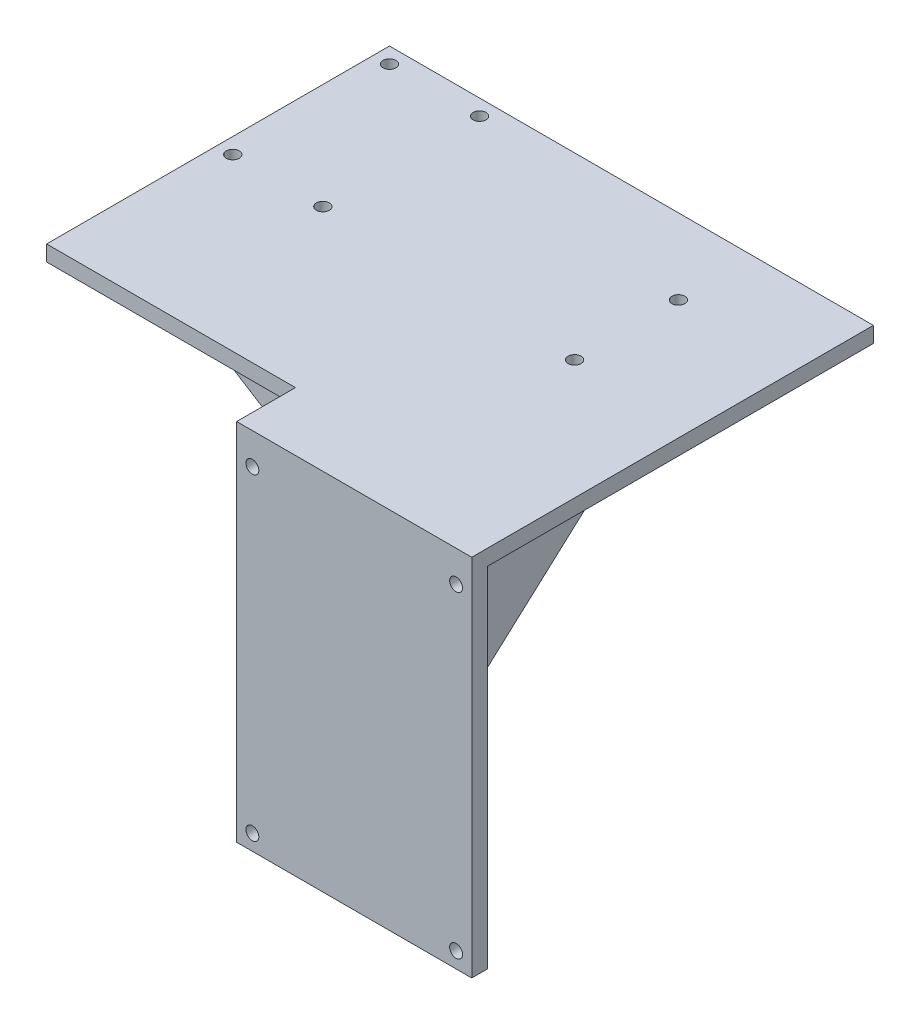
ISO-10303-21;
HEADER;
FILE_DESCRIPTION(('STEP AP214'),'2;1');
FILE_NAME('part.step','',(''),(''),'','','');
FILE_SCHEMA(('AUTOMOTIVE_DESIGN { 1 0 10303 214 1 1 1 1 }'));
ENDSEC;
DATA;
#1=APPLICATION_CONTEXT('core data for automotive mechanical design processes');
#2=APPLICATION_PROTOCOL_DEFINITION('international standard','automotive_design',2000,#1);
#3=PRODUCT_CONTEXT('',#1,'mechanical');
#4=PRODUCT('Part','Part','',(#3));
#5=PRODUCT_RELATED_PRODUCT_CATEGORY('part','',(#4));
#6=PRODUCT_DEFINITION_FORMATION('','',#4);
#7=PRODUCT_DEFINITION_CONTEXT('part definition',#1,'design');
#8=PRODUCT_DEFINITION('design','',#6,#7);
#9=PRODUCT_DEFINITION_SHAPE('','',#8);
#10=(LENGTH_UNIT() NAMED_UNIT(*) SI_UNIT(.MILLI.,.METRE.));
#11=(NAMED_UNIT(*) PLANE_ANGLE_UNIT() SI_UNIT($,.RADIAN.));
#12=(NAMED_UNIT(*) SI_UNIT($,.STERADIAN.) SOLID_ANGLE_UNIT());
#13=UNCERTAINTY_MEASURE_WITH_UNIT(LENGTH_MEASURE(1.E-05),#10,'distance_accuracy_value','');
#14=(GEOMETRIC_REPRESENTATION_CONTEXT(3) GLOBAL_UNCERTAINTY_ASSIGNED_CONTEXT((#13)) GLOBAL_UNIT_ASSIGNED_CONTEXT((#10,
#11,#12)) REPRESENTATION_CONTEXT('',''));
#15=CARTESIAN_POINT('',(0.,0.,0.));
#16=DIRECTION('',(0.,0.,1.));
#17=DIRECTION('',(1.,0.,0.));
#18=AXIS2_PLACEMENT_3D('',#15,#16,#17);
#19=CARTESIAN_POINT('',(60.,-4.,-15.));
#20=DIRECTION('',(0.,1.,0.));
#21=DIRECTION('',(0.,0.,1.));
#22=AXIS2_PLACEMENT_3D('',#19,#20,#21);
#23=PLANE('',#22);
#24=CARTESIAN_POINT('',(-59.5,-4.,-98.5));
#25=DIRECTION('',(0.,1.,0.));
#26=DIRECTION('',(0.,0.,1.));
#27=AXIS2_PLACEMENT_3D('',#24,#25,#26);
#28=CIRCLE('',#27,1.65);
#29=CARTESIAN_POINT('',(-59.5,-4.,-96.85));
#30=VERTEX_POINT('',#29);
#31=EDGE_CURVE('E215',#30,#30,#28,.T.);
#32=ORIENTED_EDGE('',*,*,#31,.T.);
#33=EDGE_LOOP('',(#32));
#34=FACE_BOUND('',#33,.T.);
#35=CARTESIAN_POINT('',(-36.5,-4.,-58.5));
#36=DIRECTION('',(0.,1.,0.));
#37=DIRECTION('',(0.,0.,1.));
#38=AXIS2_PLACEMENT_3D('',#35,#36,#37);
#39=CIRCLE('',#38,1.65);
#40=CARTESIAN_POINT('',(-36.5,-4.,-56.85));
#41=VERTEX_POINT('',#40);
#42=EDGE_CURVE('E220',#41,#41,#39,.T.);
#43=ORIENTED_EDGE('',*,*,#42,.T.);
#44=EDGE_LOOP('',(#43));
#45=FACE_BOUND('',#44,.T.);
#46=CARTESIAN_POINT('',(-59.5,-4.,-58.5));
#47=DIRECTION('',(0.,1.,0.));
#48=DIRECTION('',(0.,0.,1.));
#49=AXIS2_PLACEMENT_3D('',#46,#47,#48);
#50=CIRCLE('',#49,1.65);
#51=CARTESIAN_POINT('',(-59.5,-4.,-56.85));
#52=VERTEX_POINT('',#51);
#53=EDGE_CURVE('E223',#52,#52,#50,.T.);
#54=ORIENTED_EDGE('',*,*,#53,.T.);
#55=EDGE_LOOP('',(#54));
#56=FACE_BOUND('',#55,.T.);
#57=CARTESIAN_POINT('',(-36.5,-4.,-98.5));
#58=DIRECTION('',(0.,1.,0.));
#59=DIRECTION('',(0.,0.,1.));
#60=AXIS2_PLACEMENT_3D('',#57,#58,#59);
#61=CIRCLE('',#60,1.65);
#62=CARTESIAN_POINT('',(-36.5,-4.,-96.85));
#63=VERTEX_POINT('',#62);
#64=EDGE_CURVE('E227',#63,#63,#61,.T.);
#65=ORIENTED_EDGE('',*,*,#64,.T.);
#66=EDGE_LOOP('',(#65));
#67=FACE_BOUND('',#66,.T.);
#68=DIRECTION('',(1.,0.,0.));
#69=VECTOR('',#68,1.);
#70=CARTESIAN_POINT('',(-63.5,-4.,-50.5));
#71=LINE('',#70,#69);
#72=CARTESIAN_POINT('',(-63.5,-4.,-50.5));
#73=VERTEX_POINT('',#72);
#74=CARTESIAN_POINT('',(8.00000000000001,-4.,-50.5));
#75=VERTEX_POINT('',#74);
#76=EDGE_CURVE('E146',#73,#75,#71,.T.);
#77=ORIENTED_EDGE('',*,*,#76,.F.);
#78=DIRECTION('',(0.,0.,1.));
#79=VECTOR('',#78,1.);
#80=CARTESIAN_POINT('',(-63.5,-4.,-102.5));
#81=LINE('',#80,#79);
#82=CARTESIAN_POINT('',(-63.5,-4.,-102.5));
#83=VERTEX_POINT('',#82);
#84=EDGE_CURVE('E155',#83,#73,#81,.T.);
#85=ORIENTED_EDGE('',*,*,#84,.F.);
#86=DIRECTION('',(-1.,0.,0.));
#87=VECTOR('',#86,1.);
#88=CARTESIAN_POINT('',(60.,-4.,-102.5));
#89=LINE('',#88,#87);
#90=CARTESIAN_POINT('',(8.,-4.,-102.5));
#91=VERTEX_POINT('',#90);
#92=EDGE_CURVE('E256',#91,#83,#89,.T.);
#93=ORIENTED_EDGE('',*,*,#92,.F.);
#94=DIRECTION('',(0.,0.,-1.));
#95=VECTOR('',#94,1.);
#96=CARTESIAN_POINT('',(8.,-4.,-102.5));
#97=LINE('',#96,#95);
#98=EDGE_CURVE('E157',#75,#91,#97,.T.);
#99=ORIENTED_EDGE('',*,*,#98,.F.);
#100=EDGE_LOOP('',(#77,#85,#93,#99));
#101=FACE_BOUND('',#100,.T.);
#102=ADVANCED_FACE('F33',(#34,#45,#56,#67,#101),#23,.F.);
#103=DIRECTION('',(-1.,0.,0.));
#104=VECTOR('',#103,1.);
#105=CARTESIAN_POINT('',(-63.5,-4.,-33.5));
#106=LINE('',#105,#104);
#107=CARTESIAN_POINT('',(8.,-4.,-33.5));
#108=VERTEX_POINT('',#107);
#109=CARTESIAN_POINT('',(-63.5,-4.,-33.5));
#110=VERTEX_POINT('',#109);
#111=EDGE_CURVE('E158',#108,#110,#106,.T.);
#112=ORIENTED_EDGE('',*,*,#111,.F.);
#113=CARTESIAN_POINT('',(8.,-4.,-4.00000000000002));
#114=VERTEX_POINT('',#113);
#115=EDGE_CURVE('E327',#114,#108,#97,.T.);
#116=ORIENTED_EDGE('',*,*,#115,.F.);
#117=DIRECTION('',(-1.,0.,0.));
#118=VECTOR('',#117,1.);
#119=CARTESIAN_POINT('',(8.,-4.,-4.00000000000002));
#120=LINE('',#119,#118);
#121=CARTESIAN_POINT('',(0.,-4.,-4.00000000000002));
#122=VERTEX_POINT('',#121);
#123=EDGE_CURVE('E332',#114,#122,#120,.T.);
#124=ORIENTED_EDGE('',*,*,#123,.T.);
#125=DIRECTION('',(0.,0.,-1.));
#126=VECTOR('',#125,1.);
#127=CARTESIAN_POINT('',(0.,-4.,-102.5));
#128=LINE('',#127,#126);
#129=CARTESIAN_POINT('',(0.,-4.,-15.));
#130=VERTEX_POINT('',#129);
#131=EDGE_CURVE('E283',#122,#130,#128,.T.);
#132=ORIENTED_EDGE('',*,*,#131,.T.);
#133=DIRECTION('',(-1.,0.,0.));
#134=VECTOR('',#133,1.);
#135=CARTESIAN_POINT('',(60.,-4.,-15.));
#136=LINE('',#135,#134);
#137=CARTESIAN_POINT('',(-63.5,-4.,-15.));
#138=VERTEX_POINT('',#137);
#139=EDGE_CURVE('E218',#130,#138,#136,.T.);
#140=ORIENTED_EDGE('',*,*,#139,.T.);
#141=EDGE_CURVE('E163',#110,#138,#81,.T.);
#142=ORIENTED_EDGE('',*,*,#141,.F.);
#143=EDGE_LOOP('',(#112,#116,#124,#132,#140,#142));
#144=FACE_BOUND('',#143,.T.);
#145=ADVANCED_FACE('F368',(#144),#23,.F.);
#146=CARTESIAN_POINT('',(8.,0.,0.));
#147=DIRECTION('',(-1.,0.,0.));
#148=DIRECTION('',(0.,0.,1.));
#149=AXIS2_PLACEMENT_3D('',#146,#147,#148);
#150=PLANE('',#149);
#151=DIRECTION('',(0.,1.,0.));
#152=VECTOR('',#151,1.);
#153=CARTESIAN_POINT('',(8.,-49.,-33.5));
#154=LINE('',#153,#152);
#155=CARTESIAN_POINT('',(8.,-49.,-33.5));
#156=VERTEX_POINT('',#155);
#157=EDGE_CURVE('E442',#156,#108,#154,.T.);
#158=ORIENTED_EDGE('',*,*,#157,.F.);
#159=DIRECTION('',(0.,0.,1.));
#160=VECTOR('',#159,1.);
#161=CARTESIAN_POINT('',(8.00000000000001,-49.,-50.5));
#162=LINE('',#161,#160);
#163=CARTESIAN_POINT('',(8.,-49.,-50.5));
#164=VERTEX_POINT('',#163);
#165=EDGE_CURVE('E443',#164,#156,#162,.T.);
#166=ORIENTED_EDGE('',*,*,#165,.F.);
#167=DIRECTION('',(0.,1.,0.));
#168=VECTOR('',#167,1.);
#169=CARTESIAN_POINT('',(8.00000000000001,-49.,-50.5));
#170=LINE('',#169,#168);
#171=EDGE_CURVE('E148',#164,#75,#170,.T.);
#172=ORIENTED_EDGE('',*,*,#171,.T.);
#173=ORIENTED_EDGE('',*,*,#98,.T.);
#174=DIRECTION('',(0.,0.670420067759688,-0.741981760385722));
#175=VECTOR('',#174,1.);
#176=CARTESIAN_POINT('',(8.,-4.,-102.5));
#177=LINE('',#176,#175);
#178=CARTESIAN_POINT('',(8.,-93.,-4.));
#179=VERTEX_POINT('',#178);
#180=EDGE_CURVE('E310',#179,#91,#177,.T.);
#181=ORIENTED_EDGE('',*,*,#180,.F.);
#182=DIRECTION('',(0.,1.,0.));
#183=VECTOR('',#182,1.);
#184=CARTESIAN_POINT('',(8.,-4.,-4.00000000000002));
#185=LINE('',#184,#183);
#186=EDGE_CURVE('E324',#179,#114,#185,.T.);
#187=ORIENTED_EDGE('',*,*,#186,.T.);
#188=ORIENTED_EDGE('',*,*,#115,.T.);
#189=EDGE_LOOP('',(#158,#166,#172,#173,#181,#187,#188));
#190=FACE_BOUND('',#189,.T.);
#191=ADVANCED_FACE('F419',(#190),#150,.T.);
#192=CARTESIAN_POINT('',(0.,0.,-4.));
#193=DIRECTION('',(0.,0.,1.));
#194=DIRECTION('',(1.,0.,0.));
#195=AXIS2_PLACEMENT_3D('',#192,#193,#194);
#196=PLANE('',#195);
#197=CARTESIAN_POINT('',(56.,-8.00000000000001,-4.));
#198=DIRECTION('',(0.,0.,1.));
#199=DIRECTION('',(1.,0.,0.));
#200=AXIS2_PLACEMENT_3D('',#197,#198,#199);
#201=CIRCLE('',#200,1.65);
#202=CARTESIAN_POINT('',(57.65,-8.00000000000001,-4.));
#203=VERTEX_POINT('',#202);
#204=EDGE_CURVE('E177',#203,#203,#201,.T.);
#205=ORIENTED_EDGE('',*,*,#204,.T.);
#206=EDGE_LOOP('',(#205));
#207=FACE_BOUND('',#206,.T.);
#208=CARTESIAN_POINT('',(56.,-89.,-4.));
#209=DIRECTION('',(0.,0.,1.));
#210=DIRECTION('',(1.,0.,0.));
#211=AXIS2_PLACEMENT_3D('',#208,#209,#210);
#212=CIRCLE('',#211,1.65);
#213=CARTESIAN_POINT('',(57.65,-89.,-4.));
#214=VERTEX_POINT('',#213);
#215=EDGE_CURVE('E187',#214,#214,#212,.T.);
#216=ORIENTED_EDGE('',*,*,#215,.T.);
#217=EDGE_LOOP('',(#216));
#218=FACE_BOUND('',#217,.T.);
#219=DIRECTION('',(0.,-1.,0.));
#220=VECTOR('',#219,1.);
#221=CARTESIAN_POINT('',(25.,-93.,-4.));
#222=LINE('',#221,#220);
#223=CARTESIAN_POINT('',(25.,-4.,-4.));
#224=VERTEX_POINT('',#223);
#225=CARTESIAN_POINT('',(25.,-93.,-4.));
#226=VERTEX_POINT('',#225);
#227=EDGE_CURVE('E316',#224,#226,#222,.T.);
#228=ORIENTED_EDGE('',*,*,#227,.F.);
#229=DIRECTION('',(-1.,0.,0.));
#230=VECTOR('',#229,1.);
#231=CARTESIAN_POINT('',(60.,-4.,-4.));
#232=LINE('',#231,#230);
#233=CARTESIAN_POINT('',(60.,-4.,-4.));
#234=VERTEX_POINT('',#233);
#235=EDGE_CURVE('E58',#234,#224,#232,.T.);
#236=ORIENTED_EDGE('',*,*,#235,.F.);
#237=DIRECTION('',(0.,1.,0.));
#238=VECTOR('',#237,1.);
#239=CARTESIAN_POINT('',(60.,0.,-4.));
#240=LINE('',#239,#238);
#241=CARTESIAN_POINT('',(60.,-93.,-4.));
#242=VERTEX_POINT('',#241);
#243=EDGE_CURVE('E197',#242,#234,#240,.T.);
#244=ORIENTED_EDGE('',*,*,#243,.F.);
#245=DIRECTION('',(1.,0.,0.));
#246=VECTOR('',#245,1.);
#247=CARTESIAN_POINT('',(0.,-93.,-4.));
#248=LINE('',#247,#246);
#249=EDGE_CURVE('E195',#226,#242,#248,.T.);
#250=ORIENTED_EDGE('',*,*,#249,.F.);
#251=EDGE_LOOP('',(#228,#236,#244,#250));
#252=FACE_BOUND('',#251,.T.);
#253=ADVANCED_FACE('F416',(#207,#218,#252),#196,.F.);
#254=CARTESIAN_POINT('',(29.5,-4.,-56.75));
#255=DIRECTION('',(0.,1.,0.));
#256=DIRECTION('',(0.,0.,1.));
#257=AXIS2_PLACEMENT_3D('',#254,#255,#256);
#258=CIRCLE('',#257,1.65);
#259=CARTESIAN_POINT('',(29.5,-4.,-55.1));
#260=VERTEX_POINT('',#259);
#261=EDGE_CURVE('E37',#260,#260,#258,.T.);
#262=ORIENTED_EDGE('',*,*,#261,.T.);
#263=EDGE_LOOP('',(#262));
#264=FACE_BOUND('',#263,.T.);
#265=CARTESIAN_POINT('',(29.5,-4.,-83.25));
#266=DIRECTION('',(0.,1.,0.));
#267=DIRECTION('',(0.,0.,1.));
#268=AXIS2_PLACEMENT_3D('',#265,#266,#267);
#269=CIRCLE('',#268,1.65);
#270=CARTESIAN_POINT('',(29.5,-4.,-81.6));
#271=VERTEX_POINT('',#270);
#272=EDGE_CURVE('E229',#271,#271,#269,.T.);
#273=ORIENTED_EDGE('',*,*,#272,.T.);
#274=EDGE_LOOP('',(#273));
#275=FACE_BOUND('',#274,.T.);
#276=DIRECTION('',(0.,0.,1.));
#277=VECTOR('',#276,1.);
#278=CARTESIAN_POINT('',(25.,-4.,-4.));
#279=LINE('',#278,#277);
#280=CARTESIAN_POINT('',(25.,-4.,-102.5));
#281=VERTEX_POINT('',#280);
#282=EDGE_CURVE('E299',#281,#224,#279,.T.);
#283=ORIENTED_EDGE('',*,*,#282,.F.);
#284=CARTESIAN_POINT('',(60.,-4.,-102.5));
#285=VERTEX_POINT('',#284);
#286=EDGE_CURVE('E258',#285,#281,#89,.T.);
#287=ORIENTED_EDGE('',*,*,#286,.F.);
#288=DIRECTION('',(0.,0.,1.));
#289=VECTOR('',#288,1.);
#290=CARTESIAN_POINT('',(60.,-4.,-15.));
#291=LINE('',#290,#289);
#292=EDGE_CURVE('E172',#285,#234,#291,.T.);
#293=ORIENTED_EDGE('',*,*,#292,.T.);
#294=ORIENTED_EDGE('',*,*,#235,.T.);
#295=EDGE_LOOP('',(#283,#287,#293,#294));
#296=FACE_BOUND('',#295,.T.);
#297=ADVANCED_FACE('F298',(#264,#275,#296),#23,.F.);
#298=CARTESIAN_POINT('',(0.,0.,-4.));
#299=DIRECTION('',(-1.,0.,0.));
#300=DIRECTION('',(0.,0.,1.));
#301=AXIS2_PLACEMENT_3D('',#298,#299,#300);
#302=PLANE('',#301);
#303=ORIENTED_EDGE('',*,*,#131,.F.);
#304=DIRECTION('',(0.,1.,0.));
#305=VECTOR('',#304,1.);
#306=CARTESIAN_POINT('',(0.,-4.,-4.00000000000002));
#307=LINE('',#306,#305);
#308=CARTESIAN_POINT('',(0.,-93.,-4.));
#309=VERTEX_POINT('',#308);
#310=EDGE_CURVE('E318',#309,#122,#307,.T.);
#311=ORIENTED_EDGE('',*,*,#310,.F.);
#312=DIRECTION('',(0.,0.,1.));
#313=VECTOR('',#312,1.);
#314=CARTESIAN_POINT('',(0.,-93.,-4.));
#315=LINE('',#314,#313);
#316=CARTESIAN_POINT('',(0.,-93.,0.));
#317=VERTEX_POINT('',#316);
#318=EDGE_CURVE('E200',#309,#317,#315,.T.);
#319=ORIENTED_EDGE('',*,*,#318,.T.);
#320=DIRECTION('',(0.,-1.,0.));
#321=VECTOR('',#320,1.);
#322=CARTESIAN_POINT('',(0.,0.,0.));
#323=LINE('',#322,#321);
#324=CARTESIAN_POINT('',(0.,0.,0.));
#325=VERTEX_POINT('',#324);
#326=EDGE_CURVE('E194',#325,#317,#323,.T.);
#327=ORIENTED_EDGE('',*,*,#326,.F.);
#328=DIRECTION('',(0.,0.,1.));
#329=VECTOR('',#328,1.);
#330=CARTESIAN_POINT('',(0.,0.,-4.));
#331=LINE('',#330,#329);
#332=CARTESIAN_POINT('',(0.,0.,-15.));
#333=VERTEX_POINT('',#332);
#334=EDGE_CURVE('E11',#333,#325,#331,.T.);
#335=ORIENTED_EDGE('',*,*,#334,.F.);
#336=DIRECTION('',(0.,1.,0.));
#337=VECTOR('',#336,1.);
#338=CARTESIAN_POINT('',(0.,0.,-15.));
#339=LINE('',#338,#337);
#340=EDGE_CURVE('E165',#130,#333,#339,.T.);
#341=ORIENTED_EDGE('',*,*,#340,.F.);
#342=EDGE_LOOP('',(#303,#311,#319,#327,#335,#341));
#343=FACE_BOUND('',#342,.T.);
#344=ADVANCED_FACE('F35',(#343),#302,.T.);
#345=CARTESIAN_POINT('',(0.,0.,-4.));
#346=DIRECTION('',(0.,1.,0.));
#347=DIRECTION('',(0.,0.,1.));
#348=AXIS2_PLACEMENT_3D('',#345,#346,#347);
#349=PLANE('',#348);
#350=CARTESIAN_POINT('',(29.5,0.,-56.75));
#351=DIRECTION('',(0.,1.,0.));
#352=DIRECTION('',(0.,0.,1.));
#353=AXIS2_PLACEMENT_3D('',#350,#351,#352);
#354=CIRCLE('',#353,1.65);
#355=CARTESIAN_POINT('',(29.5,0.,-55.1));
#356=VERTEX_POINT('',#355);
#357=EDGE_CURVE('E243',#356,#356,#354,.T.);
#358=ORIENTED_EDGE('',*,*,#357,.F.);
#359=EDGE_LOOP('',(#358));
#360=FACE_BOUND('',#359,.T.);
#361=CARTESIAN_POINT('',(29.5,0.,-83.25));
#362=DIRECTION('',(0.,1.,0.));
#363=DIRECTION('',(0.,0.,1.));
#364=AXIS2_PLACEMENT_3D('',#361,#362,#363);
#365=CIRCLE('',#364,1.65);
#366=CARTESIAN_POINT('',(29.5,0.,-81.6));
#367=VERTEX_POINT('',#366);
#368=EDGE_CURVE('E232',#367,#367,#365,.T.);
#369=ORIENTED_EDGE('',*,*,#368,.F.);
#370=EDGE_LOOP('',(#369));
#371=FACE_BOUND('',#370,.T.);
#372=CARTESIAN_POINT('',(-36.5,0.,-98.5));
#373=DIRECTION('',(0.,1.,0.));
#374=DIRECTION('',(0.,0.,1.));
#375=AXIS2_PLACEMENT_3D('',#372,#373,#374);
#376=CIRCLE('',#375,1.65);
#377=CARTESIAN_POINT('',(-36.5,0.,-96.85));
#378=VERTEX_POINT('',#377);
#379=EDGE_CURVE('E224',#378,#378,#376,.T.);
#380=ORIENTED_EDGE('',*,*,#379,.F.);
#381=EDGE_LOOP('',(#380));
#382=FACE_BOUND('',#381,.T.);
#383=CARTESIAN_POINT('',(-59.5,0.,-58.5));
#384=DIRECTION('',(0.,1.,0.));
#385=DIRECTION('',(0.,0.,1.));
#386=AXIS2_PLACEMENT_3D('',#383,#384,#385);
#387=CIRCLE('',#386,1.65);
#388=CARTESIAN_POINT('',(-59.5,0.,-56.85));
#389=VERTEX_POINT('',#388);
#390=EDGE_CURVE('E236',#389,#389,#387,.T.);
#391=ORIENTED_EDGE('',*,*,#390,.F.);
#392=EDGE_LOOP('',(#391));
#393=FACE_BOUND('',#392,.T.);
#394=CARTESIAN_POINT('',(-36.5,0.,-58.5));
#395=DIRECTION('',(0.,1.,0.));
#396=DIRECTION('',(0.,0.,1.));
#397=AXIS2_PLACEMENT_3D('',#394,#395,#396);
#398=CIRCLE('',#397,1.65);
#399=CARTESIAN_POINT('',(-36.5,0.,-56.85));
#400=VERTEX_POINT('',#399);
#401=EDGE_CURVE('E231',#400,#400,#398,.T.);
#402=ORIENTED_EDGE('',*,*,#401,.F.);
#403=EDGE_LOOP('',(#402));
#404=FACE_BOUND('',#403,.T.);
#405=CARTESIAN_POINT('',(-59.5,0.,-98.5));
#406=DIRECTION('',(0.,1.,0.));
#407=DIRECTION('',(0.,0.,1.));
#408=AXIS2_PLACEMENT_3D('',#405,#406,#407);
#409=CIRCLE('',#408,1.65);
#410=CARTESIAN_POINT('',(-59.5,0.,-96.85));
#411=VERTEX_POINT('',#410);
#412=EDGE_CURVE('E219',#411,#411,#409,.T.);
#413=ORIENTED_EDGE('',*,*,#412,.F.);
#414=EDGE_LOOP('',(#413));
#415=FACE_BOUND('',#414,.T.);
#416=DIRECTION('',(-1.,0.,0.));
#417=VECTOR('',#416,1.);
#418=CARTESIAN_POINT('',(0.,0.,0.));
#419=LINE('',#418,#417);
#420=CARTESIAN_POINT('',(60.,0.,0.));
#421=VERTEX_POINT('',#420);
#422=EDGE_CURVE('E198',#421,#325,#419,.T.);
#423=ORIENTED_EDGE('',*,*,#422,.F.);
#424=DIRECTION('',(0.,0.,1.));
#425=VECTOR('',#424,1.);
#426=CARTESIAN_POINT('',(60.,0.,-4.));
#427=LINE('',#426,#425);
#428=CARTESIAN_POINT('',(60.,0.,-102.5));
#429=VERTEX_POINT('',#428);
#430=EDGE_CURVE('E42',#429,#421,#427,.T.);
#431=ORIENTED_EDGE('',*,*,#430,.F.);
#432=DIRECTION('',(1.,0.,0.));
#433=VECTOR('',#432,1.);
#434=CARTESIAN_POINT('',(60.,0.,-102.5));
#435=LINE('',#434,#433);
#436=CARTESIAN_POINT('',(-63.5,0.,-102.5));
#437=VERTEX_POINT('',#436);
#438=EDGE_CURVE('E261',#437,#429,#435,.T.);
#439=ORIENTED_EDGE('',*,*,#438,.F.);
#440=DIRECTION('',(0.,0.,1.));
#441=VECTOR('',#440,1.);
#442=CARTESIAN_POINT('',(-63.5,0.,-102.5));
#443=LINE('',#442,#441);
#444=CARTESIAN_POINT('',(-63.5,0.,-15.));
#445=VERTEX_POINT('',#444);
#446=EDGE_CURVE('E167',#437,#445,#443,.T.);
#447=ORIENTED_EDGE('',*,*,#446,.T.);
#448=DIRECTION('',(1.,0.,0.));
#449=VECTOR('',#448,1.);
#450=CARTESIAN_POINT('',(60.,0.,-15.));
#451=LINE('',#450,#449);
#452=EDGE_CURVE('E257',#445,#333,#451,.T.);
#453=ORIENTED_EDGE('',*,*,#452,.T.);
#454=ORIENTED_EDGE('',*,*,#334,.T.);
#455=EDGE_LOOP('',(#423,#431,#439,#447,#453,#454));
#456=FACE_BOUND('',#455,.T.);
#457=ADVANCED_FACE('F272',(#360,#371,#382,#393,#404,#415,#456),#349,.T.);
#458=CARTESIAN_POINT('',(60.,0.,-4.));
#459=DIRECTION('',(1.,0.,0.));
#460=DIRECTION('',(0.,1.,0.));
#461=AXIS2_PLACEMENT_3D('',#458,#459,#460);
#462=PLANE('',#461);
#463=DIRECTION('',(0.,1.,0.));
#464=VECTOR('',#463,1.);
#465=CARTESIAN_POINT('',(60.,0.,0.));
#466=LINE('',#465,#464);
#467=CARTESIAN_POINT('',(60.,-93.,0.));
#468=VERTEX_POINT('',#467);
#469=EDGE_CURVE('E206',#468,#421,#466,.T.);
#470=ORIENTED_EDGE('',*,*,#469,.F.);
#471=DIRECTION('',(0.,0.,1.));
#472=VECTOR('',#471,1.);
#473=CARTESIAN_POINT('',(60.,-93.,-4.));
#474=LINE('',#473,#472);
#475=EDGE_CURVE('E212',#242,#468,#474,.T.);
#476=ORIENTED_EDGE('',*,*,#475,.F.);
#477=ORIENTED_EDGE('',*,*,#243,.T.);
#478=ORIENTED_EDGE('',*,*,#292,.F.);
#479=DIRECTION('',(0.,-1.,0.));
#480=VECTOR('',#479,1.);
#481=CARTESIAN_POINT('',(60.,-4.,-102.5));
#482=LINE('',#481,#480);
#483=EDGE_CURVE('E253',#429,#285,#482,.T.);
#484=ORIENTED_EDGE('',*,*,#483,.F.);
#485=ORIENTED_EDGE('',*,*,#430,.T.);
#486=EDGE_LOOP('',(#470,#476,#477,#478,#484,#485));
#487=FACE_BOUND('',#486,.T.);
#488=ADVANCED_FACE('F293',(#487),#462,.T.);
#489=CARTESIAN_POINT('',(0.,-93.,-4.));
#490=DIRECTION('',(0.,-1.,0.));
#491=DIRECTION('',(0.,0.,-1.));
#492=AXIS2_PLACEMENT_3D('',#489,#490,#491);
#493=PLANE('',#492);
#494=DIRECTION('',(-1.,0.,0.));
#495=VECTOR('',#494,1.);
#496=CARTESIAN_POINT('',(28.,-93.,-4.));
#497=LINE('',#496,#495);
#498=EDGE_CURVE('E311',#226,#179,#497,.T.);
#499=ORIENTED_EDGE('',*,*,#498,.F.);
#500=ORIENTED_EDGE('',*,*,#249,.T.);
#501=ORIENTED_EDGE('',*,*,#475,.T.);
#502=DIRECTION('',(1.,0.,0.));
#503=VECTOR('',#502,1.);
#504=CARTESIAN_POINT('',(0.,-93.,0.));
#505=LINE('',#504,#503);
#506=EDGE_CURVE('E203',#317,#468,#505,.T.);
#507=ORIENTED_EDGE('',*,*,#506,.F.);
#508=ORIENTED_EDGE('',*,*,#318,.F.);
#509=DIRECTION('',(-1.,0.,0.));
#510=VECTOR('',#509,1.);
#511=CARTESIAN_POINT('',(8.,-93.,-4.));
#512=LINE('',#511,#510);
#513=EDGE_CURVE('E329',#179,#309,#512,.T.);
#514=ORIENTED_EDGE('',*,*,#513,.F.);
#515=EDGE_LOOP('',(#499,#500,#501,#507,#508,#514));
#516=FACE_BOUND('',#515,.T.);
#517=ADVANCED_FACE('F422',(#516),#493,.T.);
#518=CARTESIAN_POINT('',(0.,0.,0.));
#519=DIRECTION('',(0.,0.,1.));
#520=DIRECTION('',(1.,0.,0.));
#521=AXIS2_PLACEMENT_3D('',#518,#519,#520);
#522=PLANE('',#521);
#523=CARTESIAN_POINT('',(56.,-8.00000000000001,0.));
#524=DIRECTION('',(0.,0.,1.));
#525=DIRECTION('',(1.,0.,0.));
#526=AXIS2_PLACEMENT_3D('',#523,#524,#525);
#527=CIRCLE('',#526,1.65);
#528=CARTESIAN_POINT('',(57.65,-8.00000000000001,0.));
#529=VERTEX_POINT('',#528);
#530=EDGE_CURVE('E181',#529,#529,#527,.T.);
#531=ORIENTED_EDGE('',*,*,#530,.F.);
#532=EDGE_LOOP('',(#531));
#533=FACE_BOUND('',#532,.T.);
#534=CARTESIAN_POINT('',(4.,-89.,0.));
#535=DIRECTION('',(0.,0.,1.));
#536=DIRECTION('',(1.,0.,0.));
#537=AXIS2_PLACEMENT_3D('',#534,#535,#536);
#538=CIRCLE('',#537,1.65);
#539=CARTESIAN_POINT('',(5.65,-89.,0.));
#540=VERTEX_POINT('',#539);
#541=EDGE_CURVE('E184',#540,#540,#538,.T.);
#542=ORIENTED_EDGE('',*,*,#541,.F.);
#543=EDGE_LOOP('',(#542));
#544=FACE_BOUND('',#543,.T.);
#545=CARTESIAN_POINT('',(56.,-89.,0.));
#546=DIRECTION('',(0.,0.,1.));
#547=DIRECTION('',(1.,0.,0.));
#548=AXIS2_PLACEMENT_3D('',#545,#546,#547);
#549=CIRCLE('',#548,1.65);
#550=CARTESIAN_POINT('',(57.65,-89.,0.));
#551=VERTEX_POINT('',#550);
#552=EDGE_CURVE('E176',#551,#551,#549,.T.);
#553=ORIENTED_EDGE('',*,*,#552,.F.);
#554=EDGE_LOOP('',(#553));
#555=FACE_BOUND('',#554,.T.);
#556=CARTESIAN_POINT('',(4.,-8.,0.));
#557=DIRECTION('',(0.,0.,1.));
#558=DIRECTION('',(1.,0.,0.));
#559=AXIS2_PLACEMENT_3D('',#556,#557,#558);
#560=CIRCLE('',#559,1.65);
#561=CARTESIAN_POINT('',(5.65,-8.,0.));
#562=VERTEX_POINT('',#561);
#563=EDGE_CURVE('E180',#562,#562,#560,.T.);
#564=ORIENTED_EDGE('',*,*,#563,.F.);
#565=EDGE_LOOP('',(#564));
#566=FACE_BOUND('',#565,.T.);
#567=ORIENTED_EDGE('',*,*,#326,.T.);
#568=ORIENTED_EDGE('',*,*,#506,.T.);
#569=ORIENTED_EDGE('',*,*,#469,.T.);
#570=ORIENTED_EDGE('',*,*,#422,.T.);
#571=EDGE_LOOP('',(#567,#568,#569,#570));
#572=FACE_BOUND('',#571,.T.);
#573=ADVANCED_FACE('F287',(#533,#544,#555,#566,#572),#522,.T.);
#574=CARTESIAN_POINT('',(4.,-8.,-4.));
#575=DIRECTION('',(0.,0.,1.));
#576=DIRECTION('',(1.,0.,0.));
#577=AXIS2_PLACEMENT_3D('',#574,#575,#576);
#578=CYLINDRICAL_SURFACE('',#577,1.65);
#579=CARTESIAN_POINT('',(4.,-8.,-4.00000000000002));
#580=DIRECTION('',(0.,0.,1.));
#581=DIRECTION('',(0.,-1.,0.));
#582=AXIS2_PLACEMENT_3D('',#579,#580,#581);
#583=CIRCLE('',#582,1.65);
#584=CARTESIAN_POINT('',(4.,-9.65,-4.00000000000002));
#585=VERTEX_POINT('',#584);
#586=EDGE_CURVE('E338',#585,#585,#583,.F.);
#587=ORIENTED_EDGE('',*,*,#586,.T.);
#588=EDGE_LOOP('',(#587));
#589=FACE_BOUND('',#588,.T.);
#590=ORIENTED_EDGE('',*,*,#563,.T.);
#591=EDGE_LOOP('',(#590));
#592=FACE_BOUND('',#591,.T.);
#593=ADVANCED_FACE('F411',(#589,#592),#578,.F.);
#594=CARTESIAN_POINT('',(56.,-89.,-4.));
#595=DIRECTION('',(0.,0.,1.));
#596=DIRECTION('',(1.,0.,0.));
#597=AXIS2_PLACEMENT_3D('',#594,#595,#596);
#598=CYLINDRICAL_SURFACE('',#597,1.65);
#599=ORIENTED_EDGE('',*,*,#215,.F.);
#600=EDGE_LOOP('',(#599));
#601=FACE_BOUND('',#600,.T.);
#602=ORIENTED_EDGE('',*,*,#552,.T.);
#603=EDGE_LOOP('',(#602));
#604=FACE_BOUND('',#603,.T.);
#605=ADVANCED_FACE('F407',(#601,#604),#598,.F.);
#606=CARTESIAN_POINT('',(4.,-89.,-4.));
#607=DIRECTION('',(0.,0.,1.));
#608=DIRECTION('',(1.,0.,0.));
#609=AXIS2_PLACEMENT_3D('',#606,#607,#608);
#610=CYLINDRICAL_SURFACE('',#609,1.65);
#611=CARTESIAN_POINT('',(4.,-89.,-4.));
#612=DIRECTION('',(0.,0.,1.));
#613=DIRECTION('',(0.,-1.,0.));
#614=AXIS2_PLACEMENT_3D('',#611,#612,#613);
#615=CIRCLE('',#614,1.65);
#616=CARTESIAN_POINT('',(4.,-90.65,-4.));
#617=VERTEX_POINT('',#616);
#618=EDGE_CURVE('E334',#617,#617,#615,.F.);
#619=ORIENTED_EDGE('',*,*,#618,.T.);
#620=EDGE_LOOP('',(#619));
#621=FACE_BOUND('',#620,.T.);
#622=ORIENTED_EDGE('',*,*,#541,.T.);
#623=EDGE_LOOP('',(#622));
#624=FACE_BOUND('',#623,.T.);
#625=ADVANCED_FACE('F403',(#621,#624),#610,.F.);
#626=CARTESIAN_POINT('',(56.,-8.00000000000001,-4.));
#627=DIRECTION('',(0.,0.,1.));
#628=DIRECTION('',(1.,0.,0.));
#629=AXIS2_PLACEMENT_3D('',#626,#627,#628);
#630=CYLINDRICAL_SURFACE('',#629,1.65);
#631=ORIENTED_EDGE('',*,*,#204,.F.);
#632=EDGE_LOOP('',(#631));
#633=FACE_BOUND('',#632,.T.);
#634=ORIENTED_EDGE('',*,*,#530,.T.);
#635=EDGE_LOOP('',(#634));
#636=FACE_BOUND('',#635,.T.);
#637=ADVANCED_FACE('F399',(#633,#636),#630,.F.);
#638=CARTESIAN_POINT('',(-63.5,-4.,-102.5));
#639=DIRECTION('',(1.,0.,0.));
#640=DIRECTION('',(0.,0.,-1.));
#641=AXIS2_PLACEMENT_3D('',#638,#639,#640);
#642=PLANE('',#641);
#643=ORIENTED_EDGE('',*,*,#84,.T.);
#644=DIRECTION('',(0.,0.,-1.));
#645=VECTOR('',#644,1.);
#646=CARTESIAN_POINT('',(-63.5,-4.,-5.49999999999999));
#647=LINE('',#646,#645);
#648=EDGE_CURVE('E135',#110,#73,#647,.T.);
#649=ORIENTED_EDGE('',*,*,#648,.F.);
#650=ORIENTED_EDGE('',*,*,#141,.T.);
#651=DIRECTION('',(0.,1.,0.));
#652=VECTOR('',#651,1.);
#653=CARTESIAN_POINT('',(-63.5,-4.,-15.));
#654=LINE('',#653,#652);
#655=EDGE_CURVE('E266',#138,#445,#654,.T.);
#656=ORIENTED_EDGE('',*,*,#655,.T.);
#657=ORIENTED_EDGE('',*,*,#446,.F.);
#658=DIRECTION('',(0.,1.,0.));
#659=VECTOR('',#658,1.);
#660=CARTESIAN_POINT('',(-63.5,-4.,-102.5));
#661=LINE('',#660,#659);
#662=EDGE_CURVE('E162',#83,#437,#661,.T.);
#663=ORIENTED_EDGE('',*,*,#662,.F.);
#664=EDGE_LOOP('',(#643,#649,#650,#656,#657,#663));
#665=FACE_BOUND('',#664,.T.);
#666=ADVANCED_FACE('F160',(#665),#642,.F.);
#667=CARTESIAN_POINT('',(0.,0.,-102.5));
#668=DIRECTION('',(0.,0.,1.));
#669=DIRECTION('',(1.,0.,0.));
#670=AXIS2_PLACEMENT_3D('',#667,#668,#669);
#671=PLANE('',#670);
#672=ORIENTED_EDGE('',*,*,#286,.T.);
#673=DIRECTION('',(-1.,0.,0.));
#674=VECTOR('',#673,1.);
#675=CARTESIAN_POINT('',(28.,-4.,-102.5));
#676=LINE('',#675,#674);
#677=EDGE_CURVE('E302',#281,#91,#676,.T.);
#678=ORIENTED_EDGE('',*,*,#677,.T.);
#679=ORIENTED_EDGE('',*,*,#92,.T.);
#680=ORIENTED_EDGE('',*,*,#662,.T.);
#681=ORIENTED_EDGE('',*,*,#438,.T.);
#682=ORIENTED_EDGE('',*,*,#483,.T.);
#683=EDGE_LOOP('',(#672,#678,#679,#680,#681,#682));
#684=FACE_BOUND('',#683,.T.);
#685=ADVANCED_FACE('F292',(#684),#671,.F.);
#686=CARTESIAN_POINT('',(0.,0.,-15.));
#687=DIRECTION('',(0.,0.,1.));
#688=DIRECTION('',(1.,0.,0.));
#689=AXIS2_PLACEMENT_3D('',#686,#687,#688);
#690=PLANE('',#689);
#691=ORIENTED_EDGE('',*,*,#139,.F.);
#692=ORIENTED_EDGE('',*,*,#340,.T.);
#693=ORIENTED_EDGE('',*,*,#452,.F.);
#694=ORIENTED_EDGE('',*,*,#655,.F.);
#695=EDGE_LOOP('',(#691,#692,#693,#694));
#696=FACE_BOUND('',#695,.T.);
#697=ADVANCED_FACE('F278',(#696),#690,.T.);
#698=CARTESIAN_POINT('',(-59.5,-87.5,-98.5));
#699=DIRECTION('',(0.,1.,0.));
#700=DIRECTION('',(0.,0.,1.));
#701=AXIS2_PLACEMENT_3D('',#698,#699,#700);
#702=CYLINDRICAL_SURFACE('',#701,1.65);
#703=ORIENTED_EDGE('',*,*,#412,.T.);
#704=EDGE_LOOP('',(#703));
#705=FACE_BOUND('',#704,.T.);
#706=ORIENTED_EDGE('',*,*,#31,.F.);
#707=EDGE_LOOP('',(#706));
#708=FACE_BOUND('',#707,.T.);
#709=ADVANCED_FACE('F359',(#705,#708),#702,.F.);
#710=CARTESIAN_POINT('',(-36.5,-87.5,-58.5));
#711=DIRECTION('',(0.,1.,0.));
#712=DIRECTION('',(0.,0.,1.));
#713=AXIS2_PLACEMENT_3D('',#710,#711,#712);
#714=CYLINDRICAL_SURFACE('',#713,1.65);
#715=ORIENTED_EDGE('',*,*,#401,.T.);
#716=EDGE_LOOP('',(#715));
#717=FACE_BOUND('',#716,.T.);
#718=ORIENTED_EDGE('',*,*,#42,.F.);
#719=EDGE_LOOP('',(#718));
#720=FACE_BOUND('',#719,.T.);
#721=ADVANCED_FACE('F362',(#717,#720),#714,.F.);
#722=CARTESIAN_POINT('',(-59.5,-87.5,-58.5));
#723=DIRECTION('',(0.,1.,0.));
#724=DIRECTION('',(0.,0.,1.));
#725=AXIS2_PLACEMENT_3D('',#722,#723,#724);
#726=CYLINDRICAL_SURFACE('',#725,1.65);
#727=ORIENTED_EDGE('',*,*,#390,.T.);
#728=EDGE_LOOP('',(#727));
#729=FACE_BOUND('',#728,.T.);
#730=ORIENTED_EDGE('',*,*,#53,.F.);
#731=EDGE_LOOP('',(#730));
#732=FACE_BOUND('',#731,.T.);
#733=ADVANCED_FACE('F379',(#729,#732),#726,.F.);
#734=CARTESIAN_POINT('',(-36.5,-87.5,-98.5));
#735=DIRECTION('',(0.,1.,0.));
#736=DIRECTION('',(0.,0.,1.));
#737=AXIS2_PLACEMENT_3D('',#734,#735,#736);
#738=CYLINDRICAL_SURFACE('',#737,1.65);
#739=ORIENTED_EDGE('',*,*,#379,.T.);
#740=EDGE_LOOP('',(#739));
#741=FACE_BOUND('',#740,.T.);
#742=ORIENTED_EDGE('',*,*,#64,.F.);
#743=EDGE_LOOP('',(#742));
#744=FACE_BOUND('',#743,.T.);
#745=ADVANCED_FACE('F376',(#741,#744),#738,.F.);
#746=CARTESIAN_POINT('',(29.5,-10.,-83.25));
#747=DIRECTION('',(0.,1.,0.));
#748=DIRECTION('',(0.,0.,1.));
#749=AXIS2_PLACEMENT_3D('',#746,#747,#748);
#750=CYLINDRICAL_SURFACE('',#749,1.65);
#751=ORIENTED_EDGE('',*,*,#368,.T.);
#752=EDGE_LOOP('',(#751));
#753=FACE_BOUND('',#752,.T.);
#754=ORIENTED_EDGE('',*,*,#272,.F.);
#755=EDGE_LOOP('',(#754));
#756=FACE_BOUND('',#755,.T.);
#757=ADVANCED_FACE('F378',(#753,#756),#750,.F.);
#758=CARTESIAN_POINT('',(29.5,-10.,-56.75));
#759=DIRECTION('',(0.,1.,0.));
#760=DIRECTION('',(0.,0.,1.));
#761=AXIS2_PLACEMENT_3D('',#758,#759,#760);
#762=CYLINDRICAL_SURFACE('',#761,1.65);
#763=ORIENTED_EDGE('',*,*,#357,.T.);
#764=EDGE_LOOP('',(#763));
#765=FACE_BOUND('',#764,.T.);
#766=ORIENTED_EDGE('',*,*,#261,.F.);
#767=EDGE_LOOP('',(#766));
#768=FACE_BOUND('',#767,.T.);
#769=ADVANCED_FACE('F344',(#765,#768),#762,.F.);
#770=CARTESIAN_POINT('',(25.,0.,0.));
#771=DIRECTION('',(-1.,0.,0.));
#772=DIRECTION('',(0.,0.,1.));
#773=AXIS2_PLACEMENT_3D('',#770,#771,#772);
#774=PLANE('',#773);
#775=ORIENTED_EDGE('',*,*,#227,.T.);
#776=DIRECTION('',(0.,0.670420067759688,-0.741981760385722));
#777=VECTOR('',#776,1.);
#778=CARTESIAN_POINT('',(25.,-53.1896925935908,-48.0597222419247));
#779=LINE('',#778,#777);
#780=EDGE_CURVE('E307',#226,#281,#779,.T.);
#781=ORIENTED_EDGE('',*,*,#780,.T.);
#782=ORIENTED_EDGE('',*,*,#282,.T.);
#783=EDGE_LOOP('',(#775,#781,#782));
#784=FACE_BOUND('',#783,.T.);
#785=ADVANCED_FACE('F315',(#784),#774,.F.);
#786=CARTESIAN_POINT('',(8.,-4.,-4.00000000000002));
#787=DIRECTION('',(0.,0.,1.));
#788=DIRECTION('',(0.,-1.,0.));
#789=AXIS2_PLACEMENT_3D('',#786,#787,#788);
#790=PLANE('',#789);
#791=ORIENTED_EDGE('',*,*,#618,.F.);
#792=EDGE_LOOP('',(#791));
#793=FACE_BOUND('',#792,.T.);
#794=ORIENTED_EDGE('',*,*,#310,.T.);
#795=ORIENTED_EDGE('',*,*,#123,.F.);
#796=ORIENTED_EDGE('',*,*,#186,.F.);
#797=ORIENTED_EDGE('',*,*,#513,.T.);
#798=EDGE_LOOP('',(#794,#795,#796,#797));
#799=FACE_BOUND('',#798,.T.);
#800=ORIENTED_EDGE('',*,*,#586,.F.);
#801=EDGE_LOOP('',(#800));
#802=FACE_BOUND('',#801,.T.);
#803=ADVANCED_FACE('F437',(#793,#799,#802),#790,.F.);
#804=CARTESIAN_POINT('',(28.,-4.,-102.5));
#805=DIRECTION('',(0.,0.741981760385722,0.670420067759688));
#806=DIRECTION('',(0.,-0.670420067759688,0.741981760385722));
#807=AXIS2_PLACEMENT_3D('',#804,#805,#806);
#808=PLANE('',#807);
#809=ORIENTED_EDGE('',*,*,#498,.T.);
#810=ORIENTED_EDGE('',*,*,#180,.T.);
#811=ORIENTED_EDGE('',*,*,#677,.F.);
#812=ORIENTED_EDGE('',*,*,#780,.F.);
#813=EDGE_LOOP('',(#809,#810,#811,#812));
#814=FACE_BOUND('',#813,.T.);
#815=ADVANCED_FACE('F306',(#814),#808,.F.);
#816=CARTESIAN_POINT('',(-63.5,-49.,-50.5));
#817=DIRECTION('',(0.,0.,1.));
#818=DIRECTION('',(1.,0.,0.));
#819=AXIS2_PLACEMENT_3D('',#816,#817,#818);
#820=PLANE('',#819);
#821=ORIENTED_EDGE('',*,*,#171,.F.);
#822=DIRECTION('',(0.846331659376491,-0.532656289118072,0.));
#823=VECTOR('',#822,1.);
#824=CARTESIAN_POINT('',(-63.5,-4.,-50.5));
#825=LINE('',#824,#823);
#826=EDGE_CURVE('E50',#73,#164,#825,.T.);
#827=ORIENTED_EDGE('',*,*,#826,.F.);
#828=ORIENTED_EDGE('',*,*,#76,.T.);
#829=EDGE_LOOP('',(#821,#827,#828));
#830=FACE_BOUND('',#829,.T.);
#831=ADVANCED_FACE('F145',(#830),#820,.F.);
#832=CARTESIAN_POINT('',(-63.5,-49.,-33.5));
#833=DIRECTION('',(0.,0.,-1.));
#834=DIRECTION('',(-1.,0.,0.));
#835=AXIS2_PLACEMENT_3D('',#832,#833,#834);
#836=PLANE('',#835);
#837=ORIENTED_EDGE('',*,*,#111,.T.);
#838=DIRECTION('',(0.846331659376491,-0.532656289118072,0.));
#839=VECTOR('',#838,1.);
#840=CARTESIAN_POINT('',(-43.213825352902,-16.7675225051666,-33.5));
#841=LINE('',#840,#839);
#842=EDGE_CURVE('E138',#110,#156,#841,.T.);
#843=ORIENTED_EDGE('',*,*,#842,.T.);
#844=ORIENTED_EDGE('',*,*,#157,.T.);
#845=EDGE_LOOP('',(#837,#843,#844));
#846=FACE_BOUND('',#845,.T.);
#847=ADVANCED_FACE('F450',(#846),#836,.F.);
#848=CARTESIAN_POINT('',(-63.5,-4.,-5.49999999999999));
#849=DIRECTION('',(0.532656289118072,0.846331659376491,0.));
#850=DIRECTION('',(-0.846331659376492,0.532656289118072,0.));
#851=AXIS2_PLACEMENT_3D('',#848,#849,#850);
#852=PLANE('',#851);
#853=ORIENTED_EDGE('',*,*,#648,.T.);
#854=ORIENTED_EDGE('',*,*,#826,.T.);
#855=ORIENTED_EDGE('',*,*,#165,.T.);
#856=ORIENTED_EDGE('',*,*,#842,.F.);
#857=EDGE_LOOP('',(#853,#854,#855,#856));
#858=FACE_BOUND('',#857,.T.);
#859=ADVANCED_FACE('F136',(#858),#852,.F.);
#860=CLOSED_SHELL('',(#102,#145,#191,#253,#297,#344,#457,#488,#517,#573,#593,#605,#625,#637,
#666,#685,#697,#709,#721,#733,#745,#757,#769,#785,#803,#815,#831,#847,#859));
#861=MANIFOLD_SOLID_BREP('B2',#860);
#862=ADVANCED_BREP_SHAPE_REPRESENTATION('',(#18,#861),#14);
#863=SHAPE_DEFINITION_REPRESENTATION(#9,#862);
ENDSEC;
END-ISO-10303-21;
